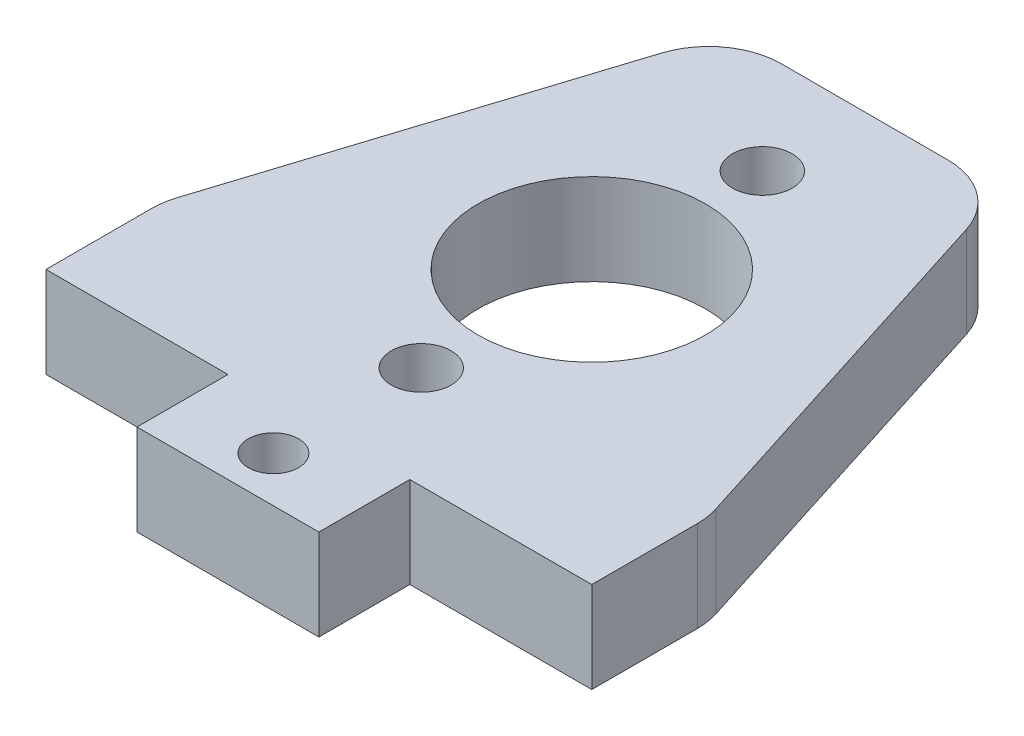
ISO-10303-21;
HEADER;
FILE_DESCRIPTION(('STEP AP214'),'2;1');
FILE_NAME('part.step','',(''),(''),'','','');
FILE_SCHEMA(('AUTOMOTIVE_DESIGN { 1 0 10303 214 1 1 1 1 }'));
ENDSEC;
DATA;
#1=APPLICATION_CONTEXT('core data for automotive mechanical design processes');
#2=APPLICATION_PROTOCOL_DEFINITION('international standard','automotive_design',2000,#1);
#3=PRODUCT_CONTEXT('',#1,'mechanical');
#4=PRODUCT('Part','Part','',(#3));
#5=PRODUCT_RELATED_PRODUCT_CATEGORY('part','',(#4));
#6=PRODUCT_DEFINITION_FORMATION('','',#4);
#7=PRODUCT_DEFINITION_CONTEXT('part definition',#1,'design');
#8=PRODUCT_DEFINITION('design','',#6,#7);
#9=PRODUCT_DEFINITION_SHAPE('','',#8);
#10=(LENGTH_UNIT() NAMED_UNIT(*) SI_UNIT(.MILLI.,.METRE.));
#11=(NAMED_UNIT(*) PLANE_ANGLE_UNIT() SI_UNIT($,.RADIAN.));
#12=(NAMED_UNIT(*) SI_UNIT($,.STERADIAN.) SOLID_ANGLE_UNIT());
#13=UNCERTAINTY_MEASURE_WITH_UNIT(LENGTH_MEASURE(1.E-05),#10,'distance_accuracy_value','');
#14=(GEOMETRIC_REPRESENTATION_CONTEXT(3) GLOBAL_UNCERTAINTY_ASSIGNED_CONTEXT((#13)) GLOBAL_UNIT_ASSIGNED_CONTEXT((#10,
#11,#12)) REPRESENTATION_CONTEXT('',''));
#15=CARTESIAN_POINT('',(0.,0.,0.));
#16=DIRECTION('',(0.,0.,1.));
#17=DIRECTION('',(1.,0.,0.));
#18=AXIS2_PLACEMENT_3D('',#15,#16,#17);
#19=CARTESIAN_POINT('',(0.,3.175,0.));
#20=DIRECTION('',(0.,-1.,0.));
#21=DIRECTION('',(0.,0.,-1.));
#22=AXIS2_PLACEMENT_3D('',#19,#20,#21);
#23=PLANE('',#22);
#24=CARTESIAN_POINT('',(0.,3.175,30.95625));
#25=DIRECTION('',(0.,1.,0.));
#26=DIRECTION('',(0.,0.,-1.));
#27=AXIS2_PLACEMENT_3D('',#24,#25,#26);
#28=CIRCLE('',#27,2.0828);
#29=CARTESIAN_POINT('',(0.,3.175,28.87345));
#30=VERTEX_POINT('',#29);
#31=EDGE_CURVE('E458',#30,#30,#28,.T.);
#32=ORIENTED_EDGE('',*,*,#31,.F.);
#33=EDGE_LOOP('',(#32));
#34=FACE_BOUND('',#33,.T.);
#35=CARTESIAN_POINT('',(0.,3.175,19.05));
#36=DIRECTION('',(0.,1.,0.));
#37=DIRECTION('',(0.,0.,1.));
#38=AXIS2_PLACEMENT_3D('',#35,#36,#37);
#39=CIRCLE('',#38,7.9375);
#40=CARTESIAN_POINT('',(0.,3.175,26.9875));
#41=VERTEX_POINT('',#40);
#42=EDGE_CURVE('E464',#41,#41,#39,.T.);
#43=ORIENTED_EDGE('',*,*,#42,.F.);
#44=EDGE_LOOP('',(#43));
#45=FACE_BOUND('',#44,.T.);
#46=CARTESIAN_POINT('',(0.,3.175,7.14375));
#47=DIRECTION('',(0.,1.,0.));
#48=DIRECTION('',(0.,0.,1.));
#49=AXIS2_PLACEMENT_3D('',#46,#47,#48);
#50=CIRCLE('',#49,2.0828);
#51=CARTESIAN_POINT('',(0.,3.175,9.22655));
#52=VERTEX_POINT('',#51);
#53=EDGE_CURVE('E461',#52,#52,#50,.T.);
#54=ORIENTED_EDGE('',*,*,#53,.F.);
#55=EDGE_LOOP('',(#54));
#56=FACE_BOUND('',#55,.T.);
#57=DIRECTION('',(-0.303103568872615,0.,0.952957620535501));
#58=VECTOR('',#57,1.);
#59=CARTESIAN_POINT('',(-9.525,3.175,0.));
#60=LINE('',#59,#58);
#61=CARTESIAN_POINT('',(-10.651028584646,3.175,3.54023387012711));
#62=VERTEX_POINT('',#61);
#63=CARTESIAN_POINT('',(-18.8110247123203,3.175,29.1952616955352));
#64=VERTEX_POINT('',#63);
#65=EDGE_CURVE('E223',#62,#64,#60,.T.);
#66=ORIENTED_EDGE('',*,*,#65,.T.);
#67=CARTESIAN_POINT('',(-13.97,3.175,30.735027825408));
#68=DIRECTION('',(0.,-1.,0.));
#69=DIRECTION('',(0.,0.,-1.));
#70=AXIS2_PLACEMENT_3D('',#67,#68,#69);
#71=CIRCLE('',#70,5.08);
#72=CARTESIAN_POINT('',(-19.05,3.175,30.735027825408));
#73=VERTEX_POINT('',#72);
#74=EDGE_CURVE('E140',#64,#73,#71,.F.);
#75=ORIENTED_EDGE('',*,*,#74,.T.);
#76=DIRECTION('',(0.,0.,1.));
#77=VECTOR('',#76,1.);
#78=CARTESIAN_POINT('',(-19.05,3.175,38.1));
#79=LINE('',#78,#77);
#80=CARTESIAN_POINT('',(-19.05,3.175,38.1));
#81=VERTEX_POINT('',#80);
#82=EDGE_CURVE('E133',#73,#81,#79,.T.);
#83=ORIENTED_EDGE('',*,*,#82,.T.);
#84=DIRECTION('',(1.,0.,0.));
#85=VECTOR('',#84,1.);
#86=CARTESIAN_POINT('',(-19.05,3.175,38.1));
#87=LINE('',#86,#85);
#88=CARTESIAN_POINT('',(-6.34999999999999,3.175,38.1));
#89=VERTEX_POINT('',#88);
#90=EDGE_CURVE('E137',#81,#89,#87,.T.);
#91=ORIENTED_EDGE('',*,*,#90,.T.);
#92=DIRECTION('',(0.,0.,1.));
#93=VECTOR('',#92,1.);
#94=CARTESIAN_POINT('',(-6.34999999999999,3.175,38.1));
#95=LINE('',#94,#93);
#96=CARTESIAN_POINT('',(-6.35,3.175,44.45));
#97=VERTEX_POINT('',#96);
#98=EDGE_CURVE('E154',#89,#97,#95,.T.);
#99=ORIENTED_EDGE('',*,*,#98,.T.);
#100=DIRECTION('',(1.,0.,0.));
#101=VECTOR('',#100,1.);
#102=CARTESIAN_POINT('',(-6.35,3.175,44.45));
#103=LINE('',#102,#101);
#104=CARTESIAN_POINT('',(6.35,3.175,44.45));
#105=VERTEX_POINT('',#104);
#106=EDGE_CURVE('E236',#97,#105,#103,.T.);
#107=ORIENTED_EDGE('',*,*,#106,.T.);
#108=DIRECTION('',(0.,0.,-1.));
#109=VECTOR('',#108,1.);
#110=CARTESIAN_POINT('',(6.35,3.175,44.45));
#111=LINE('',#110,#109);
#112=CARTESIAN_POINT('',(6.35,3.175,38.1));
#113=VERTEX_POINT('',#112);
#114=EDGE_CURVE('E259',#105,#113,#111,.T.);
#115=ORIENTED_EDGE('',*,*,#114,.T.);
#116=DIRECTION('',(1.,0.,0.));
#117=VECTOR('',#116,1.);
#118=CARTESIAN_POINT('',(6.35,3.175,38.1));
#119=LINE('',#118,#117);
#120=CARTESIAN_POINT('',(19.05,3.175,38.1));
#121=VERTEX_POINT('',#120);
#122=EDGE_CURVE('E255',#113,#121,#119,.T.);
#123=ORIENTED_EDGE('',*,*,#122,.T.);
#124=DIRECTION('',(0.,0.,-1.));
#125=VECTOR('',#124,1.);
#126=CARTESIAN_POINT('',(19.05,3.175,38.1));
#127=LINE('',#126,#125);
#128=CARTESIAN_POINT('',(19.05,3.175,30.735027825408));
#129=VERTEX_POINT('',#128);
#130=EDGE_CURVE('E254',#121,#129,#127,.T.);
#131=ORIENTED_EDGE('',*,*,#130,.T.);
#132=CARTESIAN_POINT('',(13.97,3.175,30.735027825408));
#133=DIRECTION('',(0.,-1.,0.));
#134=DIRECTION('',(0.,0.,-1.));
#135=AXIS2_PLACEMENT_3D('',#132,#133,#134);
#136=CIRCLE('',#135,5.08);
#137=CARTESIAN_POINT('',(18.8110247123203,3.175,29.1952616955352));
#138=VERTEX_POINT('',#137);
#139=EDGE_CURVE('E54',#129,#138,#136,.F.);
#140=ORIENTED_EDGE('',*,*,#139,.T.);
#141=DIRECTION('',(-0.303103568872615,0.,-0.952957620535501));
#142=VECTOR('',#141,1.);
#143=CARTESIAN_POINT('',(9.525,3.175,0.));
#144=LINE('',#143,#142);
#145=CARTESIAN_POINT('',(10.651028584646,3.175,3.54023387012712));
#146=VERTEX_POINT('',#145);
#147=EDGE_CURVE('E200',#138,#146,#144,.T.);
#148=ORIENTED_EDGE('',*,*,#147,.T.);
#149=CARTESIAN_POINT('',(5.81000387232568,3.175,5.08));
#150=DIRECTION('',(0.,-1.,0.));
#151=DIRECTION('',(0.,0.,-1.));
#152=AXIS2_PLACEMENT_3D('',#149,#150,#151);
#153=CIRCLE('',#152,5.08);
#154=CARTESIAN_POINT('',(5.81000387232569,3.175,0.));
#155=VERTEX_POINT('',#154);
#156=EDGE_CURVE('E180',#146,#155,#153,.F.);
#157=ORIENTED_EDGE('',*,*,#156,.T.);
#158=DIRECTION('',(-1.,0.,0.));
#159=VECTOR('',#158,1.);
#160=CARTESIAN_POINT('',(-9.525,3.175,0.));
#161=LINE('',#160,#159);
#162=CARTESIAN_POINT('',(-5.81000387232568,3.175,0.));
#163=VERTEX_POINT('',#162);
#164=EDGE_CURVE('E257',#155,#163,#161,.T.);
#165=ORIENTED_EDGE('',*,*,#164,.T.);
#166=CARTESIAN_POINT('',(-5.81000387232568,3.175,5.08));
#167=DIRECTION('',(0.,-1.,0.));
#168=DIRECTION('',(0.,0.,-1.));
#169=AXIS2_PLACEMENT_3D('',#166,#167,#168);
#170=CIRCLE('',#169,5.08);
#171=EDGE_CURVE('E178',#163,#62,#170,.F.);
#172=ORIENTED_EDGE('',*,*,#171,.T.);
#173=EDGE_LOOP('',(#66,#75,#83,#91,#99,#107,#115,#123,#131,#140,#148,#157,#165,#172));
#174=FACE_BOUND('',#173,.T.);
#175=CARTESIAN_POINT('',(0.,3.175,41.275));
#176=DIRECTION('',(0.,1.,0.));
#177=DIRECTION('',(0.,0.,1.));
#178=AXIS2_PLACEMENT_3D('',#175,#176,#177);
#179=CIRCLE('',#178,1.7526);
#180=CARTESIAN_POINT('',(0.,3.175,43.0276));
#181=VERTEX_POINT('',#180);
#182=EDGE_CURVE('E266',#181,#181,#179,.T.);
#183=ORIENTED_EDGE('',*,*,#182,.F.);
#184=EDGE_LOOP('',(#183));
#185=FACE_BOUND('',#184,.T.);
#186=ADVANCED_FACE('F34',(#34,#45,#56,#174,#185),#23,.F.);
#187=CARTESIAN_POINT('',(0.,-3.175,0.));
#188=DIRECTION('',(0.,-1.,0.));
#189=DIRECTION('',(0.,0.,-1.));
#190=AXIS2_PLACEMENT_3D('',#187,#188,#189);
#191=PLANE('',#190);
#192=CARTESIAN_POINT('',(0.,-3.175,30.95625));
#193=DIRECTION('',(0.,1.,0.));
#194=DIRECTION('',(0.,0.,-1.));
#195=AXIS2_PLACEMENT_3D('',#192,#193,#194);
#196=CIRCLE('',#195,2.0828);
#197=CARTESIAN_POINT('',(0.,-3.175,28.87345));
#198=VERTEX_POINT('',#197);
#199=EDGE_CURVE('E456',#198,#198,#196,.T.);
#200=ORIENTED_EDGE('',*,*,#199,.T.);
#201=EDGE_LOOP('',(#200));
#202=FACE_BOUND('',#201,.T.);
#203=CARTESIAN_POINT('',(0.,-3.175,19.05));
#204=DIRECTION('',(0.,1.,0.));
#205=DIRECTION('',(0.,0.,1.));
#206=AXIS2_PLACEMENT_3D('',#203,#204,#205);
#207=CIRCLE('',#206,7.9375);
#208=CARTESIAN_POINT('',(0.,-3.175,26.9875));
#209=VERTEX_POINT('',#208);
#210=EDGE_CURVE('E459',#209,#209,#207,.T.);
#211=ORIENTED_EDGE('',*,*,#210,.T.);
#212=EDGE_LOOP('',(#211));
#213=FACE_BOUND('',#212,.T.);
#214=CARTESIAN_POINT('',(0.,-3.175,7.14375));
#215=DIRECTION('',(0.,1.,0.));
#216=DIRECTION('',(0.,0.,1.));
#217=AXIS2_PLACEMENT_3D('',#214,#215,#216);
#218=CIRCLE('',#217,2.0828);
#219=CARTESIAN_POINT('',(0.,-3.175,9.22655));
#220=VERTEX_POINT('',#219);
#221=EDGE_CURVE('E469',#220,#220,#218,.T.);
#222=ORIENTED_EDGE('',*,*,#221,.T.);
#223=EDGE_LOOP('',(#222));
#224=FACE_BOUND('',#223,.T.);
#225=DIRECTION('',(0.,0.,1.));
#226=VECTOR('',#225,1.);
#227=CARTESIAN_POINT('',(-19.05,-3.175,38.1));
#228=LINE('',#227,#226);
#229=CARTESIAN_POINT('',(-19.05,-3.175,30.735027825408));
#230=VERTEX_POINT('',#229);
#231=CARTESIAN_POINT('',(-19.05,-3.175,38.1));
#232=VERTEX_POINT('',#231);
#233=EDGE_CURVE('E158',#230,#232,#228,.T.);
#234=ORIENTED_EDGE('',*,*,#233,.F.);
#235=CARTESIAN_POINT('',(-13.97,-3.175,30.735027825408));
#236=DIRECTION('',(0.,-1.,0.));
#237=DIRECTION('',(0.,0.,-1.));
#238=AXIS2_PLACEMENT_3D('',#235,#236,#237);
#239=CIRCLE('',#238,5.08);
#240=CARTESIAN_POINT('',(-18.8110247123203,-3.175,29.1952616955352));
#241=VERTEX_POINT('',#240);
#242=EDGE_CURVE('E189',#230,#241,#239,.T.);
#243=ORIENTED_EDGE('',*,*,#242,.T.);
#244=DIRECTION('',(-0.303103568872615,0.,0.952957620535501));
#245=VECTOR('',#244,1.);
#246=CARTESIAN_POINT('',(-9.525,-3.175,0.));
#247=LINE('',#246,#245);
#248=CARTESIAN_POINT('',(-10.651028584646,-3.175,3.54023387012711));
#249=VERTEX_POINT('',#248);
#250=EDGE_CURVE('E145',#249,#241,#247,.T.);
#251=ORIENTED_EDGE('',*,*,#250,.F.);
#252=CARTESIAN_POINT('',(-5.81000387232568,-3.175,5.08));
#253=DIRECTION('',(0.,-1.,0.));
#254=DIRECTION('',(0.,0.,-1.));
#255=AXIS2_PLACEMENT_3D('',#252,#253,#254);
#256=CIRCLE('',#255,5.08);
#257=CARTESIAN_POINT('',(-5.81000387232568,-3.175,0.));
#258=VERTEX_POINT('',#257);
#259=EDGE_CURVE('E170',#249,#258,#256,.T.);
#260=ORIENTED_EDGE('',*,*,#259,.T.);
#261=DIRECTION('',(-1.,0.,0.));
#262=VECTOR('',#261,1.);
#263=CARTESIAN_POINT('',(-9.525,-3.175,0.));
#264=LINE('',#263,#262);
#265=CARTESIAN_POINT('',(5.81000387232569,-3.175,0.));
#266=VERTEX_POINT('',#265);
#267=EDGE_CURVE('E208',#266,#258,#264,.T.);
#268=ORIENTED_EDGE('',*,*,#267,.F.);
#269=CARTESIAN_POINT('',(5.81000387232568,-3.175,5.08));
#270=DIRECTION('',(0.,-1.,0.));
#271=DIRECTION('',(0.,0.,-1.));
#272=AXIS2_PLACEMENT_3D('',#269,#270,#271);
#273=CIRCLE('',#272,5.08);
#274=CARTESIAN_POINT('',(10.651028584646,-3.175,3.54023387012712));
#275=VERTEX_POINT('',#274);
#276=EDGE_CURVE('E172',#266,#275,#273,.T.);
#277=ORIENTED_EDGE('',*,*,#276,.T.);
#278=DIRECTION('',(-0.303103568872615,0.,-0.952957620535501));
#279=VECTOR('',#278,1.);
#280=CARTESIAN_POINT('',(9.525,-3.175,0.));
#281=LINE('',#280,#279);
#282=CARTESIAN_POINT('',(18.8110247123203,-3.175,29.1952616955352));
#283=VERTEX_POINT('',#282);
#284=EDGE_CURVE('E199',#283,#275,#281,.T.);
#285=ORIENTED_EDGE('',*,*,#284,.F.);
#286=CARTESIAN_POINT('',(13.97,-3.175,30.735027825408));
#287=DIRECTION('',(0.,-1.,0.));
#288=DIRECTION('',(0.,0.,-1.));
#289=AXIS2_PLACEMENT_3D('',#286,#287,#288);
#290=CIRCLE('',#289,5.08);
#291=CARTESIAN_POINT('',(19.05,-3.175,30.735027825408));
#292=VERTEX_POINT('',#291);
#293=EDGE_CURVE('E187',#283,#292,#290,.T.);
#294=ORIENTED_EDGE('',*,*,#293,.T.);
#295=DIRECTION('',(0.,0.,-1.));
#296=VECTOR('',#295,1.);
#297=CARTESIAN_POINT('',(19.05,-3.175,38.1));
#298=LINE('',#297,#296);
#299=CARTESIAN_POINT('',(19.05,-3.175,38.1));
#300=VERTEX_POINT('',#299);
#301=EDGE_CURVE('E209',#300,#292,#298,.T.);
#302=ORIENTED_EDGE('',*,*,#301,.F.);
#303=DIRECTION('',(1.,0.,0.));
#304=VECTOR('',#303,1.);
#305=CARTESIAN_POINT('',(6.35,-3.175,38.1));
#306=LINE('',#305,#304);
#307=CARTESIAN_POINT('',(6.35,-3.175,38.1));
#308=VERTEX_POINT('',#307);
#309=EDGE_CURVE('E213',#308,#300,#306,.T.);
#310=ORIENTED_EDGE('',*,*,#309,.F.);
#311=DIRECTION('',(0.,0.,-1.));
#312=VECTOR('',#311,1.);
#313=CARTESIAN_POINT('',(6.35,-3.175,44.45));
#314=LINE('',#313,#312);
#315=CARTESIAN_POINT('',(6.35,-3.175,44.45));
#316=VERTEX_POINT('',#315);
#317=EDGE_CURVE('E242',#316,#308,#314,.T.);
#318=ORIENTED_EDGE('',*,*,#317,.F.);
#319=DIRECTION('',(1.,0.,0.));
#320=VECTOR('',#319,1.);
#321=CARTESIAN_POINT('',(-6.35,-3.175,44.45));
#322=LINE('',#321,#320);
#323=CARTESIAN_POINT('',(-6.35,-3.175,44.45));
#324=VERTEX_POINT('',#323);
#325=EDGE_CURVE('E235',#324,#316,#322,.T.);
#326=ORIENTED_EDGE('',*,*,#325,.F.);
#327=DIRECTION('',(0.,0.,1.));
#328=VECTOR('',#327,1.);
#329=CARTESIAN_POINT('',(-6.34999999999999,-3.175,38.1));
#330=LINE('',#329,#328);
#331=CARTESIAN_POINT('',(-6.34999999999999,-3.175,38.1));
#332=VERTEX_POINT('',#331);
#333=EDGE_CURVE('E240',#332,#324,#330,.T.);
#334=ORIENTED_EDGE('',*,*,#333,.F.);
#335=DIRECTION('',(1.,0.,0.));
#336=VECTOR('',#335,1.);
#337=CARTESIAN_POINT('',(-19.05,-3.175,38.1));
#338=LINE('',#337,#336);
#339=EDGE_CURVE('E245',#232,#332,#338,.T.);
#340=ORIENTED_EDGE('',*,*,#339,.F.);
#341=EDGE_LOOP('',(#234,#243,#251,#260,#268,#277,#285,#294,#302,#310,#318,#326,#334,#340));
#342=FACE_BOUND('',#341,.T.);
#343=CARTESIAN_POINT('',(0.,-3.175,41.275));
#344=DIRECTION('',(0.,1.,0.));
#345=DIRECTION('',(0.,0.,1.));
#346=AXIS2_PLACEMENT_3D('',#343,#344,#345);
#347=CIRCLE('',#346,1.7526);
#348=CARTESIAN_POINT('',(0.,-3.175,43.0276));
#349=VERTEX_POINT('',#348);
#350=EDGE_CURVE('E472',#349,#349,#347,.T.);
#351=ORIENTED_EDGE('',*,*,#350,.T.);
#352=EDGE_LOOP('',(#351));
#353=FACE_BOUND('',#352,.T.);
#354=ADVANCED_FACE('F203',(#202,#213,#224,#342,#353),#191,.T.);
#355=CARTESIAN_POINT('',(-19.05,3.175,38.1));
#356=DIRECTION('',(1.,0.,0.));
#357=DIRECTION('',(0.,0.,-1.));
#358=AXIS2_PLACEMENT_3D('',#355,#356,#357);
#359=PLANE('',#358);
#360=ORIENTED_EDGE('',*,*,#82,.F.);
#361=DIRECTION('',(0.,-1.,0.));
#362=VECTOR('',#361,1.);
#363=CARTESIAN_POINT('',(-19.05,3.175,30.735027825408));
#364=LINE('',#363,#362);
#365=EDGE_CURVE('E185',#73,#230,#364,.T.);
#366=ORIENTED_EDGE('',*,*,#365,.T.);
#367=ORIENTED_EDGE('',*,*,#233,.T.);
#368=DIRECTION('',(0.,-1.,0.));
#369=VECTOR('',#368,1.);
#370=CARTESIAN_POINT('',(-19.05,3.175,38.1));
#371=LINE('',#370,#369);
#372=EDGE_CURVE('E150',#81,#232,#371,.T.);
#373=ORIENTED_EDGE('',*,*,#372,.F.);
#374=EDGE_LOOP('',(#360,#366,#367,#373));
#375=FACE_BOUND('',#374,.T.);
#376=ADVANCED_FACE('F156',(#375),#359,.F.);
#377=CARTESIAN_POINT('',(-19.05,3.175,38.1));
#378=DIRECTION('',(0.,0.,-1.));
#379=DIRECTION('',(-1.,0.,0.));
#380=AXIS2_PLACEMENT_3D('',#377,#378,#379);
#381=PLANE('',#380);
#382=ORIENTED_EDGE('',*,*,#339,.T.);
#383=DIRECTION('',(0.,-1.,0.));
#384=VECTOR('',#383,1.);
#385=CARTESIAN_POINT('',(-6.34999999999999,3.175,38.1));
#386=LINE('',#385,#384);
#387=EDGE_CURVE('E152',#89,#332,#386,.T.);
#388=ORIENTED_EDGE('',*,*,#387,.F.);
#389=ORIENTED_EDGE('',*,*,#90,.F.);
#390=ORIENTED_EDGE('',*,*,#372,.T.);
#391=EDGE_LOOP('',(#382,#388,#389,#390));
#392=FACE_BOUND('',#391,.T.);
#393=ADVANCED_FACE('F149',(#392),#381,.F.);
#394=CARTESIAN_POINT('',(-6.34999999999999,3.175,38.1));
#395=DIRECTION('',(1.,0.,0.));
#396=DIRECTION('',(0.,0.,-1.));
#397=AXIS2_PLACEMENT_3D('',#394,#395,#396);
#398=PLANE('',#397);
#399=ORIENTED_EDGE('',*,*,#333,.T.);
#400=DIRECTION('',(0.,-1.,0.));
#401=VECTOR('',#400,1.);
#402=CARTESIAN_POINT('',(-6.35,3.175,44.45));
#403=LINE('',#402,#401);
#404=EDGE_CURVE('E164',#97,#324,#403,.T.);
#405=ORIENTED_EDGE('',*,*,#404,.F.);
#406=ORIENTED_EDGE('',*,*,#98,.F.);
#407=ORIENTED_EDGE('',*,*,#387,.T.);
#408=EDGE_LOOP('',(#399,#405,#406,#407));
#409=FACE_BOUND('',#408,.T.);
#410=ADVANCED_FACE('F267',(#409),#398,.F.);
#411=CARTESIAN_POINT('',(-6.35,3.175,44.45));
#412=DIRECTION('',(0.,0.,-1.));
#413=DIRECTION('',(-1.,0.,0.));
#414=AXIS2_PLACEMENT_3D('',#411,#412,#413);
#415=PLANE('',#414);
#416=ORIENTED_EDGE('',*,*,#325,.T.);
#417=DIRECTION('',(0.,-1.,0.));
#418=VECTOR('',#417,1.);
#419=CARTESIAN_POINT('',(6.35,3.175,44.45));
#420=LINE('',#419,#418);
#421=EDGE_CURVE('E226',#105,#316,#420,.T.);
#422=ORIENTED_EDGE('',*,*,#421,.F.);
#423=ORIENTED_EDGE('',*,*,#106,.F.);
#424=ORIENTED_EDGE('',*,*,#404,.T.);
#425=EDGE_LOOP('',(#416,#422,#423,#424));
#426=FACE_BOUND('',#425,.T.);
#427=ADVANCED_FACE('F233',(#426),#415,.F.);
#428=CARTESIAN_POINT('',(6.35,3.175,44.45));
#429=DIRECTION('',(-1.,0.,0.));
#430=DIRECTION('',(0.,0.,1.));
#431=AXIS2_PLACEMENT_3D('',#428,#429,#430);
#432=PLANE('',#431);
#433=ORIENTED_EDGE('',*,*,#317,.T.);
#434=DIRECTION('',(0.,-1.,0.));
#435=VECTOR('',#434,1.);
#436=CARTESIAN_POINT('',(6.35,3.175,38.1));
#437=LINE('',#436,#435);
#438=EDGE_CURVE('E222',#113,#308,#437,.T.);
#439=ORIENTED_EDGE('',*,*,#438,.F.);
#440=ORIENTED_EDGE('',*,*,#114,.F.);
#441=ORIENTED_EDGE('',*,*,#421,.T.);
#442=EDGE_LOOP('',(#433,#439,#440,#441));
#443=FACE_BOUND('',#442,.T.);
#444=ADVANCED_FACE('F272',(#443),#432,.F.);
#445=CARTESIAN_POINT('',(6.35,3.175,38.1));
#446=DIRECTION('',(0.,0.,-1.));
#447=DIRECTION('',(-1.,0.,0.));
#448=AXIS2_PLACEMENT_3D('',#445,#446,#447);
#449=PLANE('',#448);
#450=ORIENTED_EDGE('',*,*,#309,.T.);
#451=DIRECTION('',(0.,-1.,0.));
#452=VECTOR('',#451,1.);
#453=CARTESIAN_POINT('',(19.05,3.175,38.1));
#454=LINE('',#453,#452);
#455=EDGE_CURVE('E219',#121,#300,#454,.T.);
#456=ORIENTED_EDGE('',*,*,#455,.F.);
#457=ORIENTED_EDGE('',*,*,#122,.F.);
#458=ORIENTED_EDGE('',*,*,#438,.T.);
#459=EDGE_LOOP('',(#450,#456,#457,#458));
#460=FACE_BOUND('',#459,.T.);
#461=ADVANCED_FACE('F250',(#460),#449,.F.);
#462=CARTESIAN_POINT('',(19.05,3.175,38.1));
#463=DIRECTION('',(-1.,0.,0.));
#464=DIRECTION('',(0.,0.,1.));
#465=AXIS2_PLACEMENT_3D('',#462,#463,#464);
#466=PLANE('',#465);
#467=ORIENTED_EDGE('',*,*,#301,.T.);
#468=DIRECTION('',(0.,-1.,0.));
#469=VECTOR('',#468,1.);
#470=CARTESIAN_POINT('',(19.05,3.175,30.735027825408));
#471=LINE('',#470,#469);
#472=EDGE_CURVE('E11',#292,#129,#471,.F.);
#473=ORIENTED_EDGE('',*,*,#472,.T.);
#474=ORIENTED_EDGE('',*,*,#130,.F.);
#475=ORIENTED_EDGE('',*,*,#455,.T.);
#476=EDGE_LOOP('',(#467,#473,#474,#475));
#477=FACE_BOUND('',#476,.T.);
#478=ADVANCED_FACE('F253',(#477),#466,.F.);
#479=CARTESIAN_POINT('',(9.525,3.175,0.));
#480=DIRECTION('',(-0.952957620535501,0.,0.303103568872615));
#481=DIRECTION('',(0.303103568872615,0.,0.952957620535501));
#482=AXIS2_PLACEMENT_3D('',#479,#480,#481);
#483=PLANE('',#482);
#484=ORIENTED_EDGE('',*,*,#147,.F.);
#485=DIRECTION('',(0.,-1.,0.));
#486=VECTOR('',#485,1.);
#487=CARTESIAN_POINT('',(18.8110247123203,3.175,29.1952616955352));
#488=LINE('',#487,#486);
#489=EDGE_CURVE('E42',#138,#283,#488,.T.);
#490=ORIENTED_EDGE('',*,*,#489,.T.);
#491=ORIENTED_EDGE('',*,*,#284,.T.);
#492=DIRECTION('',(0.,-1.,0.));
#493=VECTOR('',#492,1.);
#494=CARTESIAN_POINT('',(10.651028584646,3.175,3.54023387012712));
#495=LINE('',#494,#493);
#496=EDGE_CURVE('E175',#275,#146,#495,.F.);
#497=ORIENTED_EDGE('',*,*,#496,.T.);
#498=EDGE_LOOP('',(#484,#490,#491,#497));
#499=FACE_BOUND('',#498,.T.);
#500=ADVANCED_FACE('F198',(#499),#483,.F.);
#501=CARTESIAN_POINT('',(-9.525,3.175,0.));
#502=DIRECTION('',(0.,0.,1.));
#503=DIRECTION('',(1.,0.,0.));
#504=AXIS2_PLACEMENT_3D('',#501,#502,#503);
#505=PLANE('',#504);
#506=ORIENTED_EDGE('',*,*,#164,.F.);
#507=DIRECTION('',(0.,-1.,0.));
#508=VECTOR('',#507,1.);
#509=CARTESIAN_POINT('',(5.81000387232569,3.175,0.));
#510=LINE('',#509,#508);
#511=EDGE_CURVE('E162',#155,#266,#510,.T.);
#512=ORIENTED_EDGE('',*,*,#511,.T.);
#513=ORIENTED_EDGE('',*,*,#267,.T.);
#514=DIRECTION('',(0.,-1.,0.));
#515=VECTOR('',#514,1.);
#516=CARTESIAN_POINT('',(-5.81000387232568,3.175,0.));
#517=LINE('',#516,#515);
#518=EDGE_CURVE('E160',#258,#163,#517,.F.);
#519=ORIENTED_EDGE('',*,*,#518,.T.);
#520=EDGE_LOOP('',(#506,#512,#513,#519));
#521=FACE_BOUND('',#520,.T.);
#522=ADVANCED_FACE('F298',(#521),#505,.F.);
#523=CARTESIAN_POINT('',(-9.525,3.175,0.));
#524=DIRECTION('',(0.952957620535501,0.,0.303103568872615));
#525=DIRECTION('',(0.303103568872615,0.,-0.952957620535501));
#526=AXIS2_PLACEMENT_3D('',#523,#524,#525);
#527=PLANE('',#526);
#528=ORIENTED_EDGE('',*,*,#250,.T.);
#529=DIRECTION('',(0.,-1.,0.));
#530=VECTOR('',#529,1.);
#531=CARTESIAN_POINT('',(-18.8110247123203,3.175,29.1952616955352));
#532=LINE('',#531,#530);
#533=EDGE_CURVE('E191',#241,#64,#532,.F.);
#534=ORIENTED_EDGE('',*,*,#533,.T.);
#535=ORIENTED_EDGE('',*,*,#65,.F.);
#536=DIRECTION('',(0.,-1.,0.));
#537=VECTOR('',#536,1.);
#538=CARTESIAN_POINT('',(-10.651028584646,3.175,3.54023387012711));
#539=LINE('',#538,#537);
#540=EDGE_CURVE('E182',#62,#249,#539,.T.);
#541=ORIENTED_EDGE('',*,*,#540,.T.);
#542=EDGE_LOOP('',(#528,#534,#535,#541));
#543=FACE_BOUND('',#542,.T.);
#544=ADVANCED_FACE('F295',(#543),#527,.F.);
#545=CARTESIAN_POINT('',(0.,3.175,41.275));
#546=DIRECTION('',(0.,-1.,0.));
#547=DIRECTION('',(0.,0.,-1.));
#548=AXIS2_PLACEMENT_3D('',#545,#546,#547);
#549=CYLINDRICAL_SURFACE('',#548,1.7526);
#550=ORIENTED_EDGE('',*,*,#182,.T.);
#551=EDGE_LOOP('',(#550));
#552=FACE_BOUND('',#551,.T.);
#553=ORIENTED_EDGE('',*,*,#350,.F.);
#554=EDGE_LOOP('',(#553));
#555=FACE_BOUND('',#554,.T.);
#556=ADVANCED_FACE('F292',(#552,#555),#549,.F.);
#557=CARTESIAN_POINT('',(5.81000387232568,3.175,5.08));
#558=DIRECTION('',(0.,-1.,0.));
#559=DIRECTION('',(0.,0.,-1.));
#560=AXIS2_PLACEMENT_3D('',#557,#558,#559);
#561=CYLINDRICAL_SURFACE('',#560,5.08);
#562=ORIENTED_EDGE('',*,*,#156,.F.);
#563=ORIENTED_EDGE('',*,*,#496,.F.);
#564=ORIENTED_EDGE('',*,*,#276,.F.);
#565=ORIENTED_EDGE('',*,*,#511,.F.);
#566=EDGE_LOOP('',(#562,#563,#564,#565));
#567=FACE_BOUND('',#566,.T.);
#568=ADVANCED_FACE('F331',(#567),#561,.T.);
#569=CARTESIAN_POINT('',(-5.81000387232568,3.175,5.08));
#570=DIRECTION('',(0.,-1.,0.));
#571=DIRECTION('',(0.,0.,-1.));
#572=AXIS2_PLACEMENT_3D('',#569,#570,#571);
#573=CYLINDRICAL_SURFACE('',#572,5.08);
#574=ORIENTED_EDGE('',*,*,#171,.F.);
#575=ORIENTED_EDGE('',*,*,#518,.F.);
#576=ORIENTED_EDGE('',*,*,#259,.F.);
#577=ORIENTED_EDGE('',*,*,#540,.F.);
#578=EDGE_LOOP('',(#574,#575,#576,#577));
#579=FACE_BOUND('',#578,.T.);
#580=ADVANCED_FACE('F337',(#579),#573,.T.);
#581=CARTESIAN_POINT('',(-13.97,3.175,30.735027825408));
#582=DIRECTION('',(0.,-1.,0.));
#583=DIRECTION('',(0.,0.,-1.));
#584=AXIS2_PLACEMENT_3D('',#581,#582,#583);
#585=CYLINDRICAL_SURFACE('',#584,5.08);
#586=ORIENTED_EDGE('',*,*,#74,.F.);
#587=ORIENTED_EDGE('',*,*,#533,.F.);
#588=ORIENTED_EDGE('',*,*,#242,.F.);
#589=ORIENTED_EDGE('',*,*,#365,.F.);
#590=EDGE_LOOP('',(#586,#587,#588,#589));
#591=FACE_BOUND('',#590,.T.);
#592=ADVANCED_FACE('F345',(#591),#585,.T.);
#593=CARTESIAN_POINT('',(13.97,3.175,30.735027825408));
#594=DIRECTION('',(0.,-1.,0.));
#595=DIRECTION('',(0.,0.,-1.));
#596=AXIS2_PLACEMENT_3D('',#593,#594,#595);
#597=CYLINDRICAL_SURFACE('',#596,5.08);
#598=ORIENTED_EDGE('',*,*,#139,.F.);
#599=ORIENTED_EDGE('',*,*,#472,.F.);
#600=ORIENTED_EDGE('',*,*,#293,.F.);
#601=ORIENTED_EDGE('',*,*,#489,.F.);
#602=EDGE_LOOP('',(#598,#599,#600,#601));
#603=FACE_BOUND('',#602,.T.);
#604=ADVANCED_FACE('F36',(#603),#597,.T.);
#605=CARTESIAN_POINT('',(0.,-3.175,7.14375));
#606=DIRECTION('',(0.,1.,0.));
#607=DIRECTION('',(0.,0.,1.));
#608=AXIS2_PLACEMENT_3D('',#605,#606,#607);
#609=CYLINDRICAL_SURFACE('',#608,2.0828);
#610=ORIENTED_EDGE('',*,*,#221,.F.);
#611=EDGE_LOOP('',(#610));
#612=FACE_BOUND('',#611,.T.);
#613=ORIENTED_EDGE('',*,*,#53,.T.);
#614=EDGE_LOOP('',(#613));
#615=FACE_BOUND('',#614,.T.);
#616=ADVANCED_FACE('F358',(#612,#615),#609,.F.);
#617=CARTESIAN_POINT('',(0.,-3.175,19.05));
#618=DIRECTION('',(0.,1.,0.));
#619=DIRECTION('',(0.,0.,1.));
#620=AXIS2_PLACEMENT_3D('',#617,#618,#619);
#621=CYLINDRICAL_SURFACE('',#620,7.9375);
#622=ORIENTED_EDGE('',*,*,#210,.F.);
#623=EDGE_LOOP('',(#622));
#624=FACE_BOUND('',#623,.T.);
#625=ORIENTED_EDGE('',*,*,#42,.T.);
#626=EDGE_LOOP('',(#625));
#627=FACE_BOUND('',#626,.T.);
#628=ADVANCED_FACE('F364',(#624,#627),#621,.F.);
#629=CARTESIAN_POINT('',(0.,-3.175,30.95625));
#630=DIRECTION('',(0.,1.,0.));
#631=DIRECTION('',(0.,0.,1.));
#632=AXIS2_PLACEMENT_3D('',#629,#630,#631);
#633=CYLINDRICAL_SURFACE('',#632,2.0828);
#634=ORIENTED_EDGE('',*,*,#199,.F.);
#635=EDGE_LOOP('',(#634));
#636=FACE_BOUND('',#635,.T.);
#637=ORIENTED_EDGE('',*,*,#31,.T.);
#638=EDGE_LOOP('',(#637));
#639=FACE_BOUND('',#638,.T.);
#640=ADVANCED_FACE('F372',(#636,#639),#633,.F.);
#641=CLOSED_SHELL('',(#186,#354,#376,#393,#410,#427,#444,#461,#478,#500,#522,#544,#556,#568,
#580,#592,#604,#616,#628,#640));
#642=MANIFOLD_SOLID_BREP('B2',#641);
#643=ADVANCED_BREP_SHAPE_REPRESENTATION('',(#18,#642),#14);
#644=SHAPE_DEFINITION_REPRESENTATION(#9,#643);
ENDSEC;
END-ISO-10303-21;
